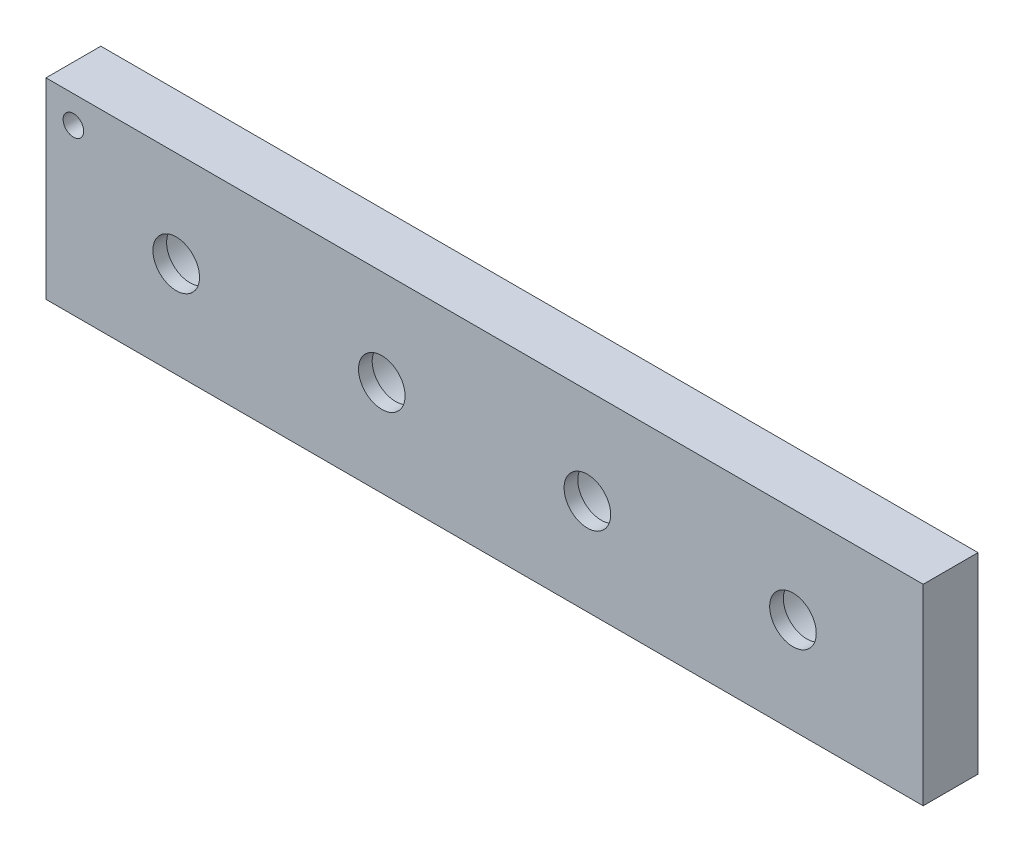
ISO-10303-21;
HEADER;
FILE_DESCRIPTION(('STEP AP214'),'2;1');
FILE_NAME('part.step','',(''),(''),'','','');
FILE_SCHEMA(('AUTOMOTIVE_DESIGN { 1 0 10303 214 1 1 1 1 }'));
ENDSEC;
DATA;
#1=APPLICATION_CONTEXT('core data for automotive mechanical design processes');
#2=APPLICATION_PROTOCOL_DEFINITION('international standard','automotive_design',2000,#1);
#3=PRODUCT_CONTEXT('',#1,'mechanical');
#4=PRODUCT('Part','Part','',(#3));
#5=PRODUCT_RELATED_PRODUCT_CATEGORY('part','',(#4));
#6=PRODUCT_DEFINITION_FORMATION('','',#4);
#7=PRODUCT_DEFINITION_CONTEXT('part definition',#1,'design');
#8=PRODUCT_DEFINITION('design','',#6,#7);
#9=PRODUCT_DEFINITION_SHAPE('','',#8);
#10=(LENGTH_UNIT() NAMED_UNIT(*) SI_UNIT(.MILLI.,.METRE.));
#11=(NAMED_UNIT(*) PLANE_ANGLE_UNIT() SI_UNIT($,.RADIAN.));
#12=(NAMED_UNIT(*) SI_UNIT($,.STERADIAN.) SOLID_ANGLE_UNIT());
#13=UNCERTAINTY_MEASURE_WITH_UNIT(LENGTH_MEASURE(1.E-05),#10,'distance_accuracy_value','');
#14=(GEOMETRIC_REPRESENTATION_CONTEXT(3) GLOBAL_UNCERTAINTY_ASSIGNED_CONTEXT((#13)) GLOBAL_UNIT_ASSIGNED_CONTEXT((#10,
#11,#12)) REPRESENTATION_CONTEXT('',''));
#15=CARTESIAN_POINT('',(0.,0.,0.));
#16=DIRECTION('',(0.,0.,1.));
#17=DIRECTION('',(1.,0.,0.));
#18=AXIS2_PLACEMENT_3D('',#15,#16,#17);
#19=CARTESIAN_POINT('',(-32.,-7.,4.00000000000001));
#20=DIRECTION('',(1.,0.,0.));
#21=DIRECTION('',(0.,0.,-1.));
#22=AXIS2_PLACEMENT_3D('',#19,#20,#21);
#23=PLANE('',#22);
#24=DIRECTION('',(0.,-1.,0.));
#25=VECTOR('',#24,1.);
#26=CARTESIAN_POINT('',(-32.,-7.,0.));
#27=LINE('',#26,#25);
#28=CARTESIAN_POINT('',(-32.,7.,0.));
#29=VERTEX_POINT('',#28);
#30=CARTESIAN_POINT('',(-32.,-7.,0.));
#31=VERTEX_POINT('',#30);
#32=EDGE_CURVE('E116',#29,#31,#27,.T.);
#33=ORIENTED_EDGE('',*,*,#32,.T.);
#34=DIRECTION('',(0.,0.,-1.));
#35=VECTOR('',#34,1.);
#36=CARTESIAN_POINT('',(-32.,-7.,4.00000000000001));
#37=LINE('',#36,#35);
#38=CARTESIAN_POINT('',(-32.,-7.,4.00000000000001));
#39=VERTEX_POINT('',#38);
#40=EDGE_CURVE('E11',#39,#31,#37,.T.);
#41=ORIENTED_EDGE('',*,*,#40,.F.);
#42=DIRECTION('',(0.,-1.,0.));
#43=VECTOR('',#42,1.);
#44=CARTESIAN_POINT('',(-32.,-7.,4.00000000000001));
#45=LINE('',#44,#43);
#46=CARTESIAN_POINT('',(-32.,7.,4.00000000000001));
#47=VERTEX_POINT('',#46);
#48=EDGE_CURVE('E97',#47,#39,#45,.T.);
#49=ORIENTED_EDGE('',*,*,#48,.F.);
#50=DIRECTION('',(0.,0.,-1.));
#51=VECTOR('',#50,1.);
#52=CARTESIAN_POINT('',(-32.,7.,4.00000000000001));
#53=LINE('',#52,#51);
#54=EDGE_CURVE('E115',#47,#29,#53,.T.);
#55=ORIENTED_EDGE('',*,*,#54,.T.);
#56=EDGE_LOOP('',(#33,#41,#49,#55));
#57=FACE_BOUND('',#56,.T.);
#58=ADVANCED_FACE('F44',(#57),#23,.F.);
#59=CARTESIAN_POINT('',(-32.,-7.,4.00000000000001));
#60=DIRECTION('',(0.,1.,0.));
#61=DIRECTION('',(0.,0.,1.));
#62=AXIS2_PLACEMENT_3D('',#59,#60,#61);
#63=PLANE('',#62);
#64=DIRECTION('',(1.,0.,0.));
#65=VECTOR('',#64,1.);
#66=CARTESIAN_POINT('',(-32.,-7.,0.));
#67=LINE('',#66,#65);
#68=CARTESIAN_POINT('',(32.,-7.,0.));
#69=VERTEX_POINT('',#68);
#70=EDGE_CURVE('E102',#31,#69,#67,.T.);
#71=ORIENTED_EDGE('',*,*,#70,.T.);
#72=DIRECTION('',(0.,0.,-1.));
#73=VECTOR('',#72,1.);
#74=CARTESIAN_POINT('',(32.,-7.,4.00000000000001));
#75=LINE('',#74,#73);
#76=CARTESIAN_POINT('',(32.,-7.,4.00000000000001));
#77=VERTEX_POINT('',#76);
#78=EDGE_CURVE('E54',#77,#69,#75,.T.);
#79=ORIENTED_EDGE('',*,*,#78,.F.);
#80=DIRECTION('',(1.,0.,0.));
#81=VECTOR('',#80,1.);
#82=CARTESIAN_POINT('',(-32.,-7.,4.00000000000001));
#83=LINE('',#82,#81);
#84=EDGE_CURVE('E94',#39,#77,#83,.T.);
#85=ORIENTED_EDGE('',*,*,#84,.F.);
#86=ORIENTED_EDGE('',*,*,#40,.T.);
#87=EDGE_LOOP('',(#71,#79,#85,#86));
#88=FACE_BOUND('',#87,.T.);
#89=ADVANCED_FACE('F103',(#88),#63,.F.);
#90=CARTESIAN_POINT('',(32.,-7.,4.00000000000001));
#91=DIRECTION('',(-1.,0.,0.));
#92=DIRECTION('',(0.,0.,1.));
#93=AXIS2_PLACEMENT_3D('',#90,#91,#92);
#94=PLANE('',#93);
#95=DIRECTION('',(0.,1.,0.));
#96=VECTOR('',#95,1.);
#97=CARTESIAN_POINT('',(32.,-7.,0.));
#98=LINE('',#97,#96);
#99=CARTESIAN_POINT('',(32.,7.,0.));
#100=VERTEX_POINT('',#99);
#101=EDGE_CURVE('E82',#69,#100,#98,.T.);
#102=ORIENTED_EDGE('',*,*,#101,.T.);
#103=DIRECTION('',(0.,0.,-1.));
#104=VECTOR('',#103,1.);
#105=CARTESIAN_POINT('',(32.,7.,4.00000000000001));
#106=LINE('',#105,#104);
#107=CARTESIAN_POINT('',(32.,7.,4.00000000000001));
#108=VERTEX_POINT('',#107);
#109=EDGE_CURVE('E106',#108,#100,#106,.T.);
#110=ORIENTED_EDGE('',*,*,#109,.F.);
#111=DIRECTION('',(0.,1.,0.));
#112=VECTOR('',#111,1.);
#113=CARTESIAN_POINT('',(32.,-7.,4.00000000000001));
#114=LINE('',#113,#112);
#115=EDGE_CURVE('E100',#77,#108,#114,.T.);
#116=ORIENTED_EDGE('',*,*,#115,.F.);
#117=ORIENTED_EDGE('',*,*,#78,.T.);
#118=EDGE_LOOP('',(#102,#110,#116,#117));
#119=FACE_BOUND('',#118,.T.);
#120=ADVANCED_FACE('F107',(#119),#94,.F.);
#121=CARTESIAN_POINT('',(-32.,7.,4.00000000000001));
#122=DIRECTION('',(0.,-1.,0.));
#123=DIRECTION('',(0.,0.,-1.));
#124=AXIS2_PLACEMENT_3D('',#121,#122,#123);
#125=PLANE('',#124);
#126=DIRECTION('',(-1.,0.,0.));
#127=VECTOR('',#126,1.);
#128=CARTESIAN_POINT('',(-32.,7.,0.));
#129=LINE('',#128,#127);
#130=EDGE_CURVE('E87',#100,#29,#129,.T.);
#131=ORIENTED_EDGE('',*,*,#130,.T.);
#132=ORIENTED_EDGE('',*,*,#54,.F.);
#133=DIRECTION('',(-1.,0.,0.));
#134=VECTOR('',#133,1.);
#135=CARTESIAN_POINT('',(-32.,7.,4.00000000000001));
#136=LINE('',#135,#134);
#137=EDGE_CURVE('E63',#108,#47,#136,.T.);
#138=ORIENTED_EDGE('',*,*,#137,.F.);
#139=ORIENTED_EDGE('',*,*,#109,.T.);
#140=EDGE_LOOP('',(#131,#132,#138,#139));
#141=FACE_BOUND('',#140,.T.);
#142=ADVANCED_FACE('F239',(#141),#125,.F.);
#143=CARTESIAN_POINT('',(0.,0.,4.00000000000001));
#144=DIRECTION('',(0.,0.,-1.));
#145=DIRECTION('',(-1.,0.,0.));
#146=AXIS2_PLACEMENT_3D('',#143,#144,#145);
#147=PLANE('',#146);
#148=CARTESIAN_POINT('',(-30.,5.,4.));
#149=DIRECTION('',(0.,0.,1.));
#150=DIRECTION('',(1.,0.,0.));
#151=AXIS2_PLACEMENT_3D('',#148,#149,#150);
#152=CIRCLE('',#151,0.750000000000001);
#153=CARTESIAN_POINT('',(-29.25,5.,4.));
#154=VERTEX_POINT('',#153);
#155=EDGE_CURVE('E199',#154,#154,#152,.T.);
#156=ORIENTED_EDGE('',*,*,#155,.F.);
#157=EDGE_LOOP('',(#156));
#158=FACE_BOUND('',#157,.T.);
#159=CARTESIAN_POINT('',(-22.5,0.,4.));
#160=DIRECTION('',(0.,0.,1.));
#161=DIRECTION('',(1.,0.,0.));
#162=AXIS2_PLACEMENT_3D('',#159,#160,#161);
#163=CIRCLE('',#162,1.7);
#164=CARTESIAN_POINT('',(-20.8,0.,4.));
#165=VERTEX_POINT('',#164);
#166=EDGE_CURVE('E137',#165,#165,#163,.T.);
#167=ORIENTED_EDGE('',*,*,#166,.F.);
#168=EDGE_LOOP('',(#167));
#169=FACE_BOUND('',#168,.T.);
#170=CARTESIAN_POINT('',(-7.5,0.,4.));
#171=DIRECTION('',(0.,0.,1.));
#172=DIRECTION('',(1.,0.,0.));
#173=AXIS2_PLACEMENT_3D('',#170,#171,#172);
#174=CIRCLE('',#173,1.7);
#175=CARTESIAN_POINT('',(-5.8,0.,4.));
#176=VERTEX_POINT('',#175);
#177=EDGE_CURVE('E194',#176,#176,#174,.T.);
#178=ORIENTED_EDGE('',*,*,#177,.F.);
#179=EDGE_LOOP('',(#178));
#180=FACE_BOUND('',#179,.T.);
#181=CARTESIAN_POINT('',(7.5,0.,4.));
#182=DIRECTION('',(0.,0.,1.));
#183=DIRECTION('',(1.,0.,0.));
#184=AXIS2_PLACEMENT_3D('',#181,#182,#183);
#185=CIRCLE('',#184,1.7);
#186=CARTESIAN_POINT('',(9.2,0.,4.));
#187=VERTEX_POINT('',#186);
#188=EDGE_CURVE('E188',#187,#187,#185,.T.);
#189=ORIENTED_EDGE('',*,*,#188,.F.);
#190=EDGE_LOOP('',(#189));
#191=FACE_BOUND('',#190,.T.);
#192=CARTESIAN_POINT('',(22.5,0.,4.));
#193=DIRECTION('',(0.,0.,1.));
#194=DIRECTION('',(1.,0.,0.));
#195=AXIS2_PLACEMENT_3D('',#192,#193,#194);
#196=CIRCLE('',#195,1.7);
#197=CARTESIAN_POINT('',(24.2,0.,4.));
#198=VERTEX_POINT('',#197);
#199=EDGE_CURVE('E183',#198,#198,#196,.T.);
#200=ORIENTED_EDGE('',*,*,#199,.F.);
#201=EDGE_LOOP('',(#200));
#202=FACE_BOUND('',#201,.T.);
#203=ORIENTED_EDGE('',*,*,#48,.T.);
#204=ORIENTED_EDGE('',*,*,#84,.T.);
#205=ORIENTED_EDGE('',*,*,#115,.T.);
#206=ORIENTED_EDGE('',*,*,#137,.T.);
#207=EDGE_LOOP('',(#203,#204,#205,#206));
#208=FACE_BOUND('',#207,.T.);
#209=ADVANCED_FACE('F92',(#158,#169,#180,#191,#202,#208),#147,.F.);
#210=CARTESIAN_POINT('',(0.,0.,0.));
#211=DIRECTION('',(0.,0.,-1.));
#212=DIRECTION('',(-1.,0.,0.));
#213=AXIS2_PLACEMENT_3D('',#210,#211,#212);
#214=PLANE('',#213);
#215=CARTESIAN_POINT('',(-30.,5.,0.));
#216=DIRECTION('',(0.,0.,-1.));
#217=DIRECTION('',(-1.,0.,0.));
#218=AXIS2_PLACEMENT_3D('',#215,#216,#217);
#219=CIRCLE('',#218,0.750000000000001);
#220=CARTESIAN_POINT('',(-30.75,5.,0.));
#221=VERTEX_POINT('',#220);
#222=EDGE_CURVE('E48',#221,#221,#219,.F.);
#223=ORIENTED_EDGE('',*,*,#222,.T.);
#224=EDGE_LOOP('',(#223));
#225=FACE_BOUND('',#224,.T.);
#226=CARTESIAN_POINT('',(-22.5,0.,0.));
#227=DIRECTION('',(0.,0.,1.));
#228=DIRECTION('',(1.,0.,0.));
#229=AXIS2_PLACEMENT_3D('',#226,#227,#228);
#230=CIRCLE('',#229,2.85);
#231=CARTESIAN_POINT('',(-19.65,0.,0.));
#232=VERTEX_POINT('',#231);
#233=EDGE_CURVE('E163',#232,#232,#230,.T.);
#234=ORIENTED_EDGE('',*,*,#233,.T.);
#235=EDGE_LOOP('',(#234));
#236=FACE_BOUND('',#235,.T.);
#237=CARTESIAN_POINT('',(-7.5,0.,0.));
#238=DIRECTION('',(0.,0.,1.));
#239=DIRECTION('',(1.,0.,0.));
#240=AXIS2_PLACEMENT_3D('',#237,#238,#239);
#241=CIRCLE('',#240,2.9);
#242=CARTESIAN_POINT('',(-4.6,0.,0.));
#243=VERTEX_POINT('',#242);
#244=EDGE_CURVE('E169',#243,#243,#241,.T.);
#245=ORIENTED_EDGE('',*,*,#244,.T.);
#246=EDGE_LOOP('',(#245));
#247=FACE_BOUND('',#246,.T.);
#248=CARTESIAN_POINT('',(7.5,0.,0.));
#249=DIRECTION('',(0.,0.,1.));
#250=DIRECTION('',(1.,0.,0.));
#251=AXIS2_PLACEMENT_3D('',#248,#249,#250);
#252=CIRCLE('',#251,2.95);
#253=CARTESIAN_POINT('',(10.45,0.,0.));
#254=VERTEX_POINT('',#253);
#255=EDGE_CURVE('E177',#254,#254,#252,.T.);
#256=ORIENTED_EDGE('',*,*,#255,.T.);
#257=EDGE_LOOP('',(#256));
#258=FACE_BOUND('',#257,.T.);
#259=CARTESIAN_POINT('',(22.5,0.,0.));
#260=DIRECTION('',(0.,0.,1.));
#261=DIRECTION('',(1.,0.,0.));
#262=AXIS2_PLACEMENT_3D('',#259,#260,#261);
#263=CIRCLE('',#262,3.);
#264=CARTESIAN_POINT('',(25.5,0.,0.));
#265=VERTEX_POINT('',#264);
#266=EDGE_CURVE('E151',#265,#265,#263,.T.);
#267=ORIENTED_EDGE('',*,*,#266,.T.);
#268=EDGE_LOOP('',(#267));
#269=FACE_BOUND('',#268,.T.);
#270=ORIENTED_EDGE('',*,*,#32,.F.);
#271=ORIENTED_EDGE('',*,*,#130,.F.);
#272=ORIENTED_EDGE('',*,*,#101,.F.);
#273=ORIENTED_EDGE('',*,*,#70,.F.);
#274=EDGE_LOOP('',(#270,#271,#272,#273));
#275=FACE_BOUND('',#274,.T.);
#276=ADVANCED_FACE('F207',(#225,#236,#247,#258,#269,#275),#214,.T.);
#277=CARTESIAN_POINT('',(22.5,0.,3.00000000000001));
#278=DIRECTION('',(0.,0.,-1.));
#279=DIRECTION('',(-1.,0.,0.));
#280=AXIS2_PLACEMENT_3D('',#277,#278,#279);
#281=CYLINDRICAL_SURFACE('',#280,3.);
#282=CARTESIAN_POINT('',(22.5,0.,3.00000000000001));
#283=DIRECTION('',(0.,0.,1.));
#284=DIRECTION('',(1.,0.,0.));
#285=AXIS2_PLACEMENT_3D('',#282,#283,#284);
#286=CIRCLE('',#285,3.);
#287=CARTESIAN_POINT('',(25.5,0.,3.00000000000001));
#288=VERTEX_POINT('',#287);
#289=EDGE_CURVE('E148',#288,#288,#286,.T.);
#290=ORIENTED_EDGE('',*,*,#289,.T.);
#291=EDGE_LOOP('',(#290));
#292=FACE_BOUND('',#291,.T.);
#293=ORIENTED_EDGE('',*,*,#266,.F.);
#294=EDGE_LOOP('',(#293));
#295=FACE_BOUND('',#294,.T.);
#296=ADVANCED_FACE('F232',(#292,#295),#281,.F.);
#297=CARTESIAN_POINT('',(22.5,0.,3.00000000000001));
#298=DIRECTION('',(0.,0.,1.));
#299=DIRECTION('',(1.,0.,0.));
#300=AXIS2_PLACEMENT_3D('',#297,#298,#299);
#301=PLANE('',#300);
#302=CARTESIAN_POINT('',(22.5,0.,3.00000000000001));
#303=DIRECTION('',(0.,0.,1.));
#304=DIRECTION('',(1.,0.,0.));
#305=AXIS2_PLACEMENT_3D('',#302,#303,#304);
#306=CIRCLE('',#305,1.7);
#307=CARTESIAN_POINT('',(24.2,0.,3.00000000000001));
#308=VERTEX_POINT('',#307);
#309=EDGE_CURVE('E141',#308,#308,#306,.F.);
#310=ORIENTED_EDGE('',*,*,#309,.F.);
#311=EDGE_LOOP('',(#310));
#312=FACE_BOUND('',#311,.T.);
#313=ORIENTED_EDGE('',*,*,#289,.F.);
#314=EDGE_LOOP('',(#313));
#315=FACE_BOUND('',#314,.T.);
#316=ADVANCED_FACE('F240',(#312,#315),#301,.F.);
#317=CARTESIAN_POINT('',(7.5,0.,3.00000000000001));
#318=DIRECTION('',(0.,0.,-1.));
#319=DIRECTION('',(-1.,0.,0.));
#320=AXIS2_PLACEMENT_3D('',#317,#318,#319);
#321=CYLINDRICAL_SURFACE('',#320,2.95);
#322=CARTESIAN_POINT('',(7.5,0.,3.00000000000001));
#323=DIRECTION('',(0.,0.,1.));
#324=DIRECTION('',(1.,0.,0.));
#325=AXIS2_PLACEMENT_3D('',#322,#323,#324);
#326=CIRCLE('',#325,2.95);
#327=CARTESIAN_POINT('',(10.45,0.,3.00000000000001));
#328=VERTEX_POINT('',#327);
#329=EDGE_CURVE('E160',#328,#328,#326,.T.);
#330=ORIENTED_EDGE('',*,*,#329,.T.);
#331=EDGE_LOOP('',(#330));
#332=FACE_BOUND('',#331,.T.);
#333=ORIENTED_EDGE('',*,*,#255,.F.);
#334=EDGE_LOOP('',(#333));
#335=FACE_BOUND('',#334,.T.);
#336=ADVANCED_FACE('F270',(#332,#335),#321,.F.);
#337=CARTESIAN_POINT('',(7.5,0.,3.00000000000001));
#338=DIRECTION('',(0.,0.,1.));
#339=DIRECTION('',(1.,0.,0.));
#340=AXIS2_PLACEMENT_3D('',#337,#338,#339);
#341=PLANE('',#340);
#342=CARTESIAN_POINT('',(7.5,0.,3.00000000000001));
#343=DIRECTION('',(0.,0.,1.));
#344=DIRECTION('',(1.,0.,0.));
#345=AXIS2_PLACEMENT_3D('',#342,#343,#344);
#346=CIRCLE('',#345,1.7);
#347=CARTESIAN_POINT('',(9.2,0.,3.00000000000001));
#348=VERTEX_POINT('',#347);
#349=EDGE_CURVE('E138',#348,#348,#346,.F.);
#350=ORIENTED_EDGE('',*,*,#349,.F.);
#351=EDGE_LOOP('',(#350));
#352=FACE_BOUND('',#351,.T.);
#353=ORIENTED_EDGE('',*,*,#329,.F.);
#354=EDGE_LOOP('',(#353));
#355=FACE_BOUND('',#354,.T.);
#356=ADVANCED_FACE('F271',(#352,#355),#341,.F.);
#357=CARTESIAN_POINT('',(-7.5,0.,3.00000000000001));
#358=DIRECTION('',(0.,0.,-1.));
#359=DIRECTION('',(-1.,0.,0.));
#360=AXIS2_PLACEMENT_3D('',#357,#358,#359);
#361=CYLINDRICAL_SURFACE('',#360,2.9);
#362=CARTESIAN_POINT('',(-7.5,0.,3.00000000000001));
#363=DIRECTION('',(0.,0.,1.));
#364=DIRECTION('',(1.,0.,0.));
#365=AXIS2_PLACEMENT_3D('',#362,#363,#364);
#366=CIRCLE('',#365,2.9);
#367=CARTESIAN_POINT('',(-4.6,0.,3.00000000000001));
#368=VERTEX_POINT('',#367);
#369=EDGE_CURVE('E172',#368,#368,#366,.T.);
#370=ORIENTED_EDGE('',*,*,#369,.T.);
#371=EDGE_LOOP('',(#370));
#372=FACE_BOUND('',#371,.T.);
#373=ORIENTED_EDGE('',*,*,#244,.F.);
#374=EDGE_LOOP('',(#373));
#375=FACE_BOUND('',#374,.T.);
#376=ADVANCED_FACE('F280',(#372,#375),#361,.F.);
#377=CARTESIAN_POINT('',(-7.5,0.,3.00000000000001));
#378=DIRECTION('',(0.,0.,1.));
#379=DIRECTION('',(1.,0.,0.));
#380=AXIS2_PLACEMENT_3D('',#377,#378,#379);
#381=PLANE('',#380);
#382=CARTESIAN_POINT('',(-7.5,0.,3.00000000000001));
#383=DIRECTION('',(0.,0.,1.));
#384=DIRECTION('',(1.,0.,0.));
#385=AXIS2_PLACEMENT_3D('',#382,#383,#384);
#386=CIRCLE('',#385,1.7);
#387=CARTESIAN_POINT('',(-5.8,0.,3.00000000000001));
#388=VERTEX_POINT('',#387);
#389=EDGE_CURVE('E135',#388,#388,#386,.F.);
#390=ORIENTED_EDGE('',*,*,#389,.F.);
#391=EDGE_LOOP('',(#390));
#392=FACE_BOUND('',#391,.T.);
#393=ORIENTED_EDGE('',*,*,#369,.F.);
#394=EDGE_LOOP('',(#393));
#395=FACE_BOUND('',#394,.T.);
#396=ADVANCED_FACE('F281',(#392,#395),#381,.F.);
#397=CARTESIAN_POINT('',(-22.5,0.,3.00000000000001));
#398=DIRECTION('',(0.,0.,-1.));
#399=DIRECTION('',(-1.,0.,0.));
#400=AXIS2_PLACEMENT_3D('',#397,#398,#399);
#401=CYLINDRICAL_SURFACE('',#400,2.85);
#402=CARTESIAN_POINT('',(-22.5,0.,3.00000000000001));
#403=DIRECTION('',(0.,0.,1.));
#404=DIRECTION('',(1.,0.,0.));
#405=AXIS2_PLACEMENT_3D('',#402,#403,#404);
#406=CIRCLE('',#405,2.85);
#407=CARTESIAN_POINT('',(-19.65,0.,3.00000000000001));
#408=VERTEX_POINT('',#407);
#409=EDGE_CURVE('E120',#408,#408,#406,.T.);
#410=ORIENTED_EDGE('',*,*,#409,.T.);
#411=EDGE_LOOP('',(#410));
#412=FACE_BOUND('',#411,.T.);
#413=ORIENTED_EDGE('',*,*,#233,.F.);
#414=EDGE_LOOP('',(#413));
#415=FACE_BOUND('',#414,.T.);
#416=ADVANCED_FACE('F289',(#412,#415),#401,.F.);
#417=CARTESIAN_POINT('',(-22.5,0.,3.00000000000001));
#418=DIRECTION('',(0.,0.,1.));
#419=DIRECTION('',(1.,0.,0.));
#420=AXIS2_PLACEMENT_3D('',#417,#418,#419);
#421=PLANE('',#420);
#422=CARTESIAN_POINT('',(-22.5,0.,3.00000000000001));
#423=DIRECTION('',(0.,0.,1.));
#424=DIRECTION('',(1.,0.,0.));
#425=AXIS2_PLACEMENT_3D('',#422,#423,#424);
#426=CIRCLE('',#425,1.7);
#427=CARTESIAN_POINT('',(-20.8,0.,3.00000000000001));
#428=VERTEX_POINT('',#427);
#429=EDGE_CURVE('E131',#428,#428,#426,.F.);
#430=ORIENTED_EDGE('',*,*,#429,.F.);
#431=EDGE_LOOP('',(#430));
#432=FACE_BOUND('',#431,.T.);
#433=ORIENTED_EDGE('',*,*,#409,.F.);
#434=EDGE_LOOP('',(#433));
#435=FACE_BOUND('',#434,.T.);
#436=ADVANCED_FACE('F295',(#432,#435),#421,.F.);
#437=CARTESIAN_POINT('',(-22.5,0.,4.));
#438=DIRECTION('',(0.,0.,-1.));
#439=DIRECTION('',(-1.,0.,0.));
#440=AXIS2_PLACEMENT_3D('',#437,#438,#439);
#441=CYLINDRICAL_SURFACE('',#440,1.7);
#442=ORIENTED_EDGE('',*,*,#166,.T.);
#443=EDGE_LOOP('',(#442));
#444=FACE_BOUND('',#443,.T.);
#445=ORIENTED_EDGE('',*,*,#429,.T.);
#446=EDGE_LOOP('',(#445));
#447=FACE_BOUND('',#446,.T.);
#448=ADVANCED_FACE('F321',(#444,#447),#441,.F.);
#449=CARTESIAN_POINT('',(-7.5,0.,4.));
#450=DIRECTION('',(0.,0.,-1.));
#451=DIRECTION('',(-1.,0.,0.));
#452=AXIS2_PLACEMENT_3D('',#449,#450,#451);
#453=CYLINDRICAL_SURFACE('',#452,1.7);
#454=ORIENTED_EDGE('',*,*,#177,.T.);
#455=EDGE_LOOP('',(#454));
#456=FACE_BOUND('',#455,.T.);
#457=ORIENTED_EDGE('',*,*,#389,.T.);
#458=EDGE_LOOP('',(#457));
#459=FACE_BOUND('',#458,.T.);
#460=ADVANCED_FACE('F329',(#456,#459),#453,.F.);
#461=CARTESIAN_POINT('',(7.5,0.,4.));
#462=DIRECTION('',(0.,0.,-1.));
#463=DIRECTION('',(-1.,0.,0.));
#464=AXIS2_PLACEMENT_3D('',#461,#462,#463);
#465=CYLINDRICAL_SURFACE('',#464,1.7);
#466=ORIENTED_EDGE('',*,*,#188,.T.);
#467=EDGE_LOOP('',(#466));
#468=FACE_BOUND('',#467,.T.);
#469=ORIENTED_EDGE('',*,*,#349,.T.);
#470=EDGE_LOOP('',(#469));
#471=FACE_BOUND('',#470,.T.);
#472=ADVANCED_FACE('F219',(#468,#471),#465,.F.);
#473=CARTESIAN_POINT('',(22.5,0.,4.));
#474=DIRECTION('',(0.,0.,-1.));
#475=DIRECTION('',(-1.,0.,0.));
#476=AXIS2_PLACEMENT_3D('',#473,#474,#475);
#477=CYLINDRICAL_SURFACE('',#476,1.7);
#478=ORIENTED_EDGE('',*,*,#199,.T.);
#479=EDGE_LOOP('',(#478));
#480=FACE_BOUND('',#479,.T.);
#481=ORIENTED_EDGE('',*,*,#309,.T.);
#482=EDGE_LOOP('',(#481));
#483=FACE_BOUND('',#482,.T.);
#484=ADVANCED_FACE('F212',(#480,#483),#477,.F.);
#485=CARTESIAN_POINT('',(-30.,5.,4.));
#486=DIRECTION('',(0.,0.,-1.));
#487=DIRECTION('',(-1.,0.,0.));
#488=AXIS2_PLACEMENT_3D('',#485,#486,#487);
#489=CYLINDRICAL_SURFACE('',#488,0.750000000000001);
#490=ORIENTED_EDGE('',*,*,#222,.F.);
#491=EDGE_LOOP('',(#490));
#492=FACE_BOUND('',#491,.T.);
#493=ORIENTED_EDGE('',*,*,#155,.T.);
#494=EDGE_LOOP('',(#493));
#495=FACE_BOUND('',#494,.T.);
#496=ADVANCED_FACE('F215',(#492,#495),#489,.F.);
#497=CLOSED_SHELL('',(#58,#89,#120,#142,#209,#276,#296,#316,#336,#356,#376,#396,#416,#436,#448,
#460,#472,#484,#496));
#498=MANIFOLD_SOLID_BREP('B2',#497);
#499=ADVANCED_BREP_SHAPE_REPRESENTATION('',(#18,#498),#14);
#500=SHAPE_DEFINITION_REPRESENTATION(#9,#499);
ENDSEC;
END-ISO-10303-21;
